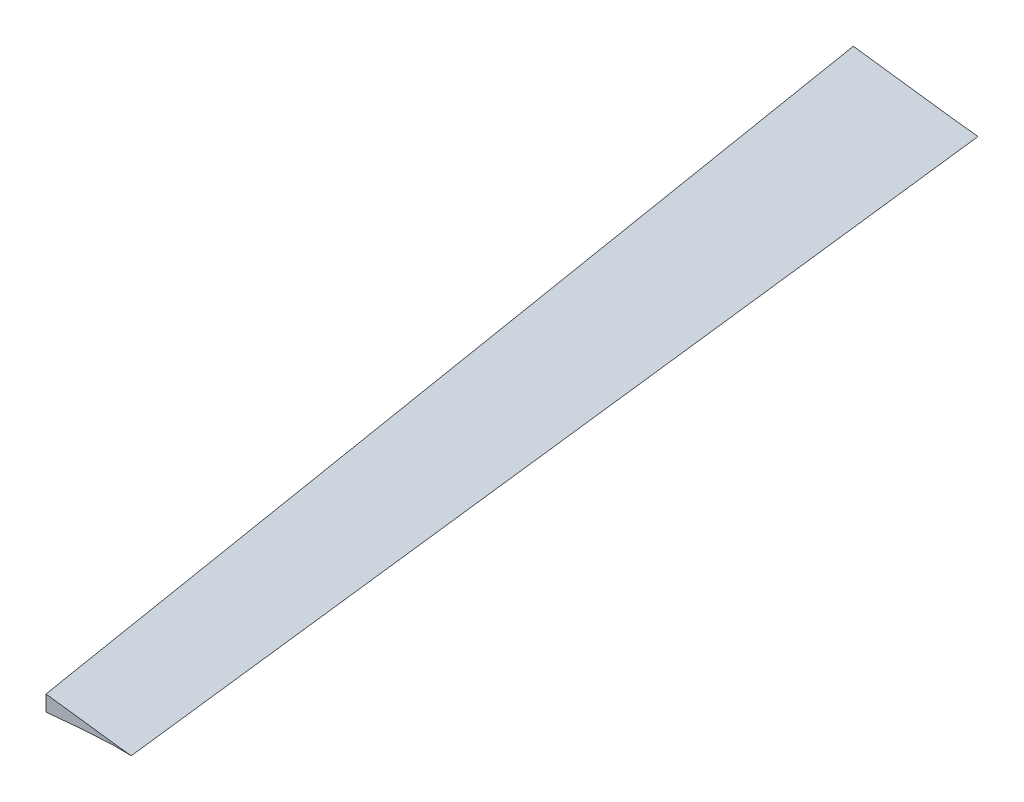
ISO-10303-21;
HEADER;
FILE_DESCRIPTION(('STEP AP214'),'2;1');
FILE_NAME('part.step','',(''),(''),'','','');
FILE_SCHEMA(('AUTOMOTIVE_DESIGN { 1 0 10303 214 1 1 1 1 }'));
ENDSEC;
DATA;
#1=APPLICATION_CONTEXT('core data for automotive mechanical design processes');
#2=APPLICATION_PROTOCOL_DEFINITION('international standard','automotive_design',2000,#1);
#3=PRODUCT_CONTEXT('',#1,'mechanical');
#4=PRODUCT('Part','Part','',(#3));
#5=PRODUCT_RELATED_PRODUCT_CATEGORY('part','',(#4));
#6=PRODUCT_DEFINITION_FORMATION('','',#4);
#7=PRODUCT_DEFINITION_CONTEXT('part definition',#1,'design');
#8=PRODUCT_DEFINITION('design','',#6,#7);
#9=PRODUCT_DEFINITION_SHAPE('','',#8);
#10=(LENGTH_UNIT() NAMED_UNIT(*) SI_UNIT(.MILLI.,.METRE.));
#11=(NAMED_UNIT(*) PLANE_ANGLE_UNIT() SI_UNIT($,.RADIAN.));
#12=(NAMED_UNIT(*) SI_UNIT($,.STERADIAN.) SOLID_ANGLE_UNIT());
#13=UNCERTAINTY_MEASURE_WITH_UNIT(LENGTH_MEASURE(1.E-05),#10,'distance_accuracy_value','');
#14=(GEOMETRIC_REPRESENTATION_CONTEXT(3) GLOBAL_UNCERTAINTY_ASSIGNED_CONTEXT((#13)) GLOBAL_UNIT_ASSIGNED_CONTEXT((#10,
#11,#12)) REPRESENTATION_CONTEXT('',''));
#15=CARTESIAN_POINT('',(0.,0.,0.));
#16=DIRECTION('',(0.,0.,1.));
#17=DIRECTION('',(1.,0.,0.));
#18=AXIS2_PLACEMENT_3D('',#15,#16,#17);
#19=CARTESIAN_POINT('',(564.25634571638,4.34483782472616,893.75));
#20=DIRECTION('',(1.03290946278982E-11,8.02308554522696E-11,1.));
#21=DIRECTION('',(0.,-1.,8.02308554522696E-11));
#22=AXIS2_PLACEMENT_3D('',#19,#20,#21);
#23=PLANE('',#22);
#24=DIRECTION('',(0.,1.,0.));
#25=VECTOR('',#24,1.);
#26=CARTESIAN_POINT('',(541.388775142328,-3.04859974673636,893.75));
#27=LINE('',#26,#25);
#28=CARTESIAN_POINT('',(541.388775142328,-3.04859974673636,893.75));
#29=VERTEX_POINT('',#28);
#30=CARTESIAN_POINT('',(541.388775142328,7.37022015255695,893.75));
#31=VERTEX_POINT('',#30);
#32=EDGE_CURVE('E242',#29,#31,#27,.T.);
#33=ORIENTED_EDGE('',*,*,#32,.F.);
#34=CARTESIAN_POINT('',(598.038775142328,0.16009125666234,893.75));
#35=CARTESIAN_POINT('',(595.580721104042,0.22766328568093,893.75));
#36=CARTESIAN_POINT('',(591.882966654915,0.329808752939016,893.75));
#37=CARTESIAN_POINT('',(586.933391400303,0.32409710421063,893.75));
#38=CARTESIAN_POINT('',(581.975538214962,0.177917623050471,893.75));
#39=CARTESIAN_POINT('',(577.01040024132,-0.115737844211306,893.75));
#40=CARTESIAN_POINT('',(570.793974388068,-0.520094719672208,893.75));
#41=CARTESIAN_POINT('',(565.814973863225,-0.881691189427431,893.75));
#42=CARTESIAN_POINT('',(559.589786901739,-1.38900859602894,893.75));
#43=CARTESIAN_POINT('',(551.85758353485,-2.06980213246714,893.75));
#44=CARTESIAN_POINT('',(545.376025557243,-2.67420703122534,893.75));
#45=CARTESIAN_POINT('',(541.388775142328,-3.04859974673636,893.75));
#46=B_SPLINE_CURVE_WITH_KNOTS('',3,(#34,#35,#36,#37,#38,#39,#40,#41,#42,#43,#44,#45),
.UNSPECIFIED.,.F.,.F.,(4,1,1,1,1,1,1,1,1,4),(0.,0.131488147376267,0.197232221064401,
0.262976294752535,0.394464442128803,0.460208515816937,0.591696663193205,0.657440736881338,
0.788928884257605,1.),.UNSPECIFIED.);
#47=CARTESIAN_POINT('',(598.038775142327,0.160091256662327,893.75));
#48=VERTEX_POINT('',#47);
#49=EDGE_CURVE('E13',#48,#29,#46,.T.);
#50=ORIENTED_EDGE('',*,*,#49,.F.);
#51=DIRECTION('',(0.993668003149023,-0.112356128083134,0.));
#52=VECTOR('',#51,1.);
#53=CARTESIAN_POINT('',(587.13407141594,1.39310900978286,893.75));
#54=LINE('',#53,#52);
#55=CARTESIAN_POINT('',(587.134977869464,1.40058375874533,893.75));
#56=VERTEX_POINT('',#55);
#57=EDGE_CURVE('E113',#56,#48,#54,.T.);
#58=ORIENTED_EDGE('',*,*,#57,.F.);
#59=CARTESIAN_POINT('',(541.388775142328,7.37022015255695,893.75));
#60=CARTESIAN_POINT('',(542.314635760137,7.25240663084081,893.75));
#61=CARTESIAN_POINT('',(545.287133728303,6.8711045704364,893.75));
#62=CARTESIAN_POINT('',(550.304364725651,6.21185169468793,893.75));
#63=CARTESIAN_POINT('',(556.440470239646,5.3929210014744,893.75));
#64=CARTESIAN_POINT('',(562.576183166571,4.57089402075966,893.75));
#65=CARTESIAN_POINT('',(568.711538568661,3.74598781379407,893.75));
#66=CARTESIAN_POINT('',(574.848161132087,2.92984097569769,893.75));
#67=CARTESIAN_POINT('',(580.98963720895,2.15018892866859,893.75));
#68=CARTESIAN_POINT('',(585.085921446884,1.64557517643275,893.75));
#69=CARTESIAN_POINT('',(587.134071415939,1.39310900978305,893.75));
#70=B_SPLINE_CURVE_WITH_KNOTS('',3,(#59,#60,#61,#62,#63,#64,#65,#66,#67,#68,#69),.UNSPECIFIED.,
.F.,.F.,(4,1,1,1,1,1,1,1,4),(0.,0.0606920988500119,0.194878941871439,0.329065784892866,
0.463252627914293,0.597439470935719,0.731626313957146,0.865813156978573,1.),.UNSPECIFIED.);
#71=EDGE_CURVE('E232',#31,#56,#70,.T.);
#72=ORIENTED_EDGE('',*,*,#71,.F.);
#73=EDGE_LOOP('',(#33,#50,#58,#72));
#74=FACE_BOUND('',#73,.T.);
#75=ADVANCED_FACE('F103',(#74),#23,.T.);
#76=CARTESIAN_POINT('',(473.363945444564,6.29781154114881,256.25));
#77=DIRECTION('',(-2.84895570752132E-11,-2.31413828593419E-10,-1.));
#78=DIRECTION('',(0.,1.,-2.31413828593419E-10));
#79=AXIS2_PLACEMENT_3D('',#76,#77,#78);
#80=PLANE('',#79);
#81=DIRECTION('',(0.,1.,0.));
#82=VECTOR('',#81,1.);
#83=CARTESIAN_POINT('',(440.228775142327,-4.41816618168187,256.25));
#84=LINE('',#83,#82);
#85=CARTESIAN_POINT('',(440.228775142327,-4.41816618168187,256.25));
#86=VERTEX_POINT('',#85);
#87=CARTESIAN_POINT('',(440.228775142327,10.6976152353225,256.25));
#88=VERTEX_POINT('',#87);
#89=EDGE_CURVE('E153',#86,#88,#84,.T.);
#90=ORIENTED_EDGE('',*,*,#89,.T.);
#91=CARTESIAN_POINT('',(506.516959670549,2.02824763226282,256.25));
#92=CARTESIAN_POINT('',(503.413789085055,2.41076141006962,256.25));
#93=CARTESIAN_POINT('',(497.207471701545,3.17530628062578,256.25));
#94=CARTESIAN_POINT('',(487.90246562231,4.35656416496528,256.25));
#95=CARTESIAN_POINT('',(478.604813145285,5.59311563809215,256.25));
#96=CARTESIAN_POINT('',(469.309080555886,6.84293851040028,256.25));
#97=CARTESIAN_POINT('',(460.012806277369,8.08839904091429,256.25));
#98=CARTESIAN_POINT('',(450.715937186623,9.32916835816602,256.249999999999));
#99=CARTESIAN_POINT('',(444.120816838155,10.1957523480049,256.25));
#100=CARTESIAN_POINT('',(440.624411845024,10.6466985559314,256.25));
#101=CARTESIAN_POINT('',(440.228775142327,10.6976152353225,256.25));
#102=B_SPLINE_CURVE_WITH_KNOTS('',3,(#91,#92,#93,#94,#95,#96,#97,#98,#99,#100,#101),
.UNSPECIFIED.,.F.,.F.,(4,1,1,1,1,1,1,1,4),(0.,0.140299917086805,0.28059983417361,
0.420899751260414,0.561199668347219,0.701499585434024,0.841799502520829,0.982099419607634,1.),.UNSPECIFIED.);
#103=CARTESIAN_POINT('',(506.518284716429,2.03917406721844,256.25));
#104=VERTEX_POINT('',#103);
#105=EDGE_CURVE('E168',#104,#88,#102,.T.);
#106=ORIENTED_EDGE('',*,*,#105,.F.);
#107=DIRECTION('',(-0.993668003149023,0.112356128083134,0.));
#108=VECTOR('',#107,1.);
#109=CARTESIAN_POINT('',(523.038775142327,0.160091256662327,256.25));
#110=LINE('',#109,#108);
#111=CARTESIAN_POINT('',(523.038775142327,0.160091256662324,256.25));
#112=VERTEX_POINT('',#111);
#113=EDGE_CURVE('E155',#112,#104,#110,.T.);
#114=ORIENTED_EDGE('',*,*,#113,.F.);
#115=CARTESIAN_POINT('',(440.228775142327,-4.41816618168187,256.25));
#116=CARTESIAN_POINT('',(445.265730808962,-3.9466557649069,256.25));
#117=CARTESIAN_POINT('',(454.078445522735,-3.1295827971776,256.25));
#118=CARTESIAN_POINT('',(464.784364502044,-2.18696397342086,256.25));
#119=CARTESIAN_POINT('',(474.216201701445,-1.41832277162378,256.25));
#120=CARTESIAN_POINT('',(481.759930533462,-0.870464682266808,256.250000000001));
#121=CARTESIAN_POINT('',(491.178493698355,-0.257819914583299,256.249999999999));
#122=CARTESIAN_POINT('',(498.701219253377,0.187100145980822,256.25));
#123=CARTESIAN_POINT('',(506.212907559604,0.408578003067788,256.25));
#124=CARTESIAN_POINT('',(513.712053897941,0.41723177383477,256.25));
#125=CARTESIAN_POINT('',(519.314555185581,0.262470250398515,256.25));
#126=CARTESIAN_POINT('',(523.038775142327,0.160091256662324,256.25));
#127=B_SPLINE_CURVE_WITH_KNOTS('',3,(#115,#116,#117,#118,#119,#120,#121,#122,#123,#124,#125,
#126),.UNSPECIFIED.,.F.,.F.,(4,1,1,1,1,1,1,1,1,4),(0.,0.182309909716823,0.318591591430685,
0.386732432287616,0.523014114001479,0.591154954858411,0.727436636572274,0.795577477429206,
0.863718318286137,1.),.UNSPECIFIED.);
#128=EDGE_CURVE('E149',#86,#112,#127,.T.);
#129=ORIENTED_EDGE('',*,*,#128,.F.);
#130=EDGE_LOOP('',(#90,#106,#114,#129));
#131=FACE_BOUND('',#130,.T.);
#132=ADVANCED_FACE('F151',(#131),#80,.T.);
#133=CARTESIAN_POINT('',(523.038775142327,0.16009125666234,256.25));
#134=CARTESIAN_POINT('',(548.038775142327,0.160091256662336,468.75));
#135=CARTESIAN_POINT('',(573.038775142327,0.160091256662331,681.25));
#136=CARTESIAN_POINT('',(598.038775142327,0.160091256662327,893.75));
#137=CARTESIAN_POINT('',(521.682237323651,0.313477836910268,256.25));
#138=CARTESIAN_POINT('',(546.826880568226,0.297122721456942,468.75));
#139=CARTESIAN_POINT('',(571.9715238128,0.280767606003617,681.25));
#140=CARTESIAN_POINT('',(597.116167057375,0.264412490550292,893.75));
#141=CARTESIAN_POINT('',(518.937430362964,0.623838924779777,256.25));
#142=CARTESIAN_POINT('',(544.389478873448,0.572724850277281,468.750000000001));
#143=CARTESIAN_POINT('',(569.841527383931,0.521610775774785,681.250000000001));
#144=CARTESIAN_POINT('',(595.293575894415,0.470496701272289,893.750000000001));
#145=CARTESIAN_POINT('',(514.771165549323,1.0949272375222,256.25));
#146=CARTESIAN_POINT('',(540.710982122887,0.988660203684612,468.75));
#147=CARTESIAN_POINT('',(566.65079869645,0.88239316984702,681.249999999999));
#148=CARTESIAN_POINT('',(592.590615270014,0.776126136009429,893.749999999999));
#149=CARTESIAN_POINT('',(510.608144558412,1.56564876441581,256.25));
#150=CARTESIAN_POINT('',(537.034031881982,1.40442068999717,468.750000000001));
#151=CARTESIAN_POINT('',(563.459919205552,1.24319261557854,681.250000000001));
#152=CARTESIAN_POINT('',(589.885806529122,1.0819645411599,893.750000000001));
#153=CARTESIAN_POINT('',(507.869554765347,1.87530686408459,256.25));
#154=CARTESIAN_POINT('',(534.599496008155,1.67969877442354,468.75));
#155=CARTESIAN_POINT('',(561.329437250964,1.48409068476248,681.25));
#156=CARTESIAN_POINT('',(588.059378493773,1.28848259510143,893.75));
#157=CARTESIAN_POINT('',(500.963521173061,2.71279483357428,256.25));
#158=CARTESIAN_POINT('',(528.420673244419,2.42899859480402,468.75));
#159=CARTESIAN_POINT('',(555.877825315776,2.14520235603377,681.25));
#160=CARTESIAN_POINT('',(583.334977387133,1.86140611726351,893.75));
#161=CARTESIAN_POINT('',(489.88764221468,4.07857273005197,256.25));
#162=CARTESIAN_POINT('',(518.497086213806,3.653165953022,468.75));
#163=CARTESIAN_POINT('',(547.106530212931,3.22775917599203,681.25));
#164=CARTESIAN_POINT('',(575.715974212057,2.80235239896206,893.75));
#165=CARTESIAN_POINT('',(473.346913385583,6.30070857969054,256.25));
#166=CARTESIAN_POINT('',(503.654291164973,5.64855337793149,468.75));
#167=CARTESIAN_POINT('',(533.961668944362,4.99639817617243,681.25));
#168=CARTESIAN_POINT('',(564.269046723752,4.34424297441338,893.75));
#169=CARTESIAN_POINT('',(456.814082858754,8.51892467026692,256.249999999999));
#170=CARTESIAN_POINT('',(488.814600752647,7.6392648712077,468.75));
#171=CARTESIAN_POINT('',(520.815118646541,6.75960507214848,681.25));
#172=CARTESIAN_POINT('',(552.815636540434,5.87994527308926,893.75));
#173=CARTESIAN_POINT('',(445.767553432239,9.9847991682499,256.25));
#174=CARTESIAN_POINT('',(478.909529582046,8.95189292309349,468.75));
#175=CARTESIAN_POINT('',(512.051505731853,7.91898667793708,681.25));
#176=CARTESIAN_POINT('',(545.193481881661,6.88608043278067,893.75));
#177=CARTESIAN_POINT('',(440.228775142327,10.6976152353225,256.25));
#178=CARTESIAN_POINT('',(473.948775142328,9.58848354106733,468.75));
#179=CARTESIAN_POINT('',(507.668775142328,8.47935184681214,681.25));
#180=CARTESIAN_POINT('',(541.388775142328,7.37022015255695,893.75));
#181=B_SPLINE_SURFACE_WITH_KNOTS('',3,3,((#133,#134,#135,#136),(#137,#138,#139,#140),(#141,#142,
#143,#144),(#145,#146,#147,#148),(#149,#150,#151,#152),(#153,#154,#155,#156),(#157,#158,#159,
#160),(#161,#162,#163,#164),(#165,#166,#167,#168),(#169,#170,#171,#172),(#173,#174,#175,#176),
(#177,#178,#179,#180)),.UNSPECIFIED.,.F.,.F.,.F.,(4,1,1,1,2,1,1,1,4),(4,4),(0.498565407541216,
0.523094332260958,0.547623256980701,0.572152181700444,0.596681106420187,0.69751082981514,
0.798340553210093,0.899170276605047,1.),(0.,1.),.UNSPECIFIED.);
#182=DIRECTION('',(0.156719407070029,-0.00515487726827554,0.987629715373109));
#183=VECTOR('',#182,1.);
#184=CARTESIAN_POINT('',(490.808775142328,9.03391769393974,575.));
#185=LINE('',#184,#183);
#186=EDGE_CURVE('E167',#88,#31,#185,.T.);
#187=DIRECTION('',(0.116841247567397,0.,0.993150604322876));
#188=VECTOR('',#187,1.);
#189=CARTESIAN_POINT('',(560.538775142327,0.160091256662334,575.));
#190=LINE('',#189,#188);
#191=EDGE_CURVE('E174',#112,#48,#190,.T.);
#192=ORIENTED_EDGE('',*,*,#113,.T.);
#193=ORIENTED_EDGE('',*,*,#105,.T.);
#194=ORIENTED_EDGE('',*,*,#186,.T.);
#195=ORIENTED_EDGE('',*,*,#71,.T.);
#196=ORIENTED_EDGE('',*,*,#57,.T.);
#197=ORIENTED_EDGE('',*,*,#191,.F.);
#198=EDGE_LOOP('',(#192,#193,#194,#195,#196,#197));
#199=FACE_BOUND('',#198,.T.);
#200=ADVANCED_FACE('F193',(#199),#181,.T.);
#201=CARTESIAN_POINT('',(440.228775142327,-4.41816618168187,256.25));
#202=CARTESIAN_POINT('',(473.948775142328,-3.96164403670004,468.75));
#203=CARTESIAN_POINT('',(507.668775142328,-3.5051218917182,681.25));
#204=CARTESIAN_POINT('',(541.388775142328,-3.04859974673636,893.75));
#205=CARTESIAN_POINT('',(443.682341979738,-4.09487710656566,256.25));
#206=CARTESIAN_POINT('',(477.038259471357,-3.67221068564129,468.75));
#207=CARTESIAN_POINT('',(510.394176962976,-3.24954426471692,681.25));
#208=CARTESIAN_POINT('',(543.750094454596,-2.82687784379255,893.75));
#209=CARTESIAN_POINT('',(450.595115017376,-3.4522756469538,256.25));
#210=CARTESIAN_POINT('',(483.222484116893,-3.09648588301535,468.75));
#211=CARTESIAN_POINT('',(515.849853216411,-2.7406961190769,681.25));
#212=CARTESIAN_POINT('',(548.477222315928,-2.38490635513845,893.75));
#213=CARTESIAN_POINT('',(460.973962189149,-2.51604895602818,256.249999999999));
#214=CARTESIAN_POINT('',(492.508024190077,-2.25700708899576,468.75));
#215=CARTESIAN_POINT('',(524.042086191006,-1.99796522196334,681.25));
#216=CARTESIAN_POINT('',(555.576148191935,-1.73892335493092,893.75));
#217=CARTESIAN_POINT('',(471.355624699941,-1.63655633315699,256.25));
#218=CARTESIAN_POINT('',(501.796380988907,-1.46641722850371,468.75));
#219=CARTESIAN_POINT('',(532.237137277872,-1.29627812385043,681.25));
#220=CARTESIAN_POINT('',(562.677893566838,-1.12613901919715,893.75));
#221=CARTESIAN_POINT('',(480.005584952657,-0.994235220161351,256.25));
#222=CARTESIAN_POINT('',(509.535632570281,-0.887956408699418,468.75));
#223=CARTESIAN_POINT('',(539.065680187905,-0.781677597237484,681.25));
#224=CARTESIAN_POINT('',(568.595727805529,-0.67539878577555,893.75));
#225=CARTESIAN_POINT('',(486.918798949692,-0.53317888168821,256.25));
#226=CARTESIAN_POINT('',(515.721165427807,-0.47355235786073,468.75));
#227=CARTESIAN_POINT('',(544.523531905922,-0.413925834033249,681.25));
#228=CARTESIAN_POINT('',(573.325898384037,-0.354299310205769,893.75));
#229=CARTESIAN_POINT('',(492.09929904093,-0.20497035684545,256.249999999999));
#230=CARTESIAN_POINT('',(520.356395511514,-0.178966118095808,468.749999999999));
#231=CARTESIAN_POINT('',(548.613491982098,-0.152961879346166,681.25));
#232=CARTESIAN_POINT('',(576.870588452682,-0.126957640596524,893.75));
#233=CARTESIAN_POINT('',(497.274492215249,0.087858341006276,256.25));
#234=CARTESIAN_POINT('',(524.986836995235,0.0854766166233383,468.75));
#235=CARTESIAN_POINT('',(552.699181775221,0.0830948922404006,681.25));
#236=CARTESIAN_POINT('',(580.411526555207,0.0807131678574628,893.75));
#237=CARTESIAN_POINT('',(502.445197899654,0.309450412558754,256.25));
#238=CARTESIAN_POINT('',(529.613195807783,0.286934322116312,468.75));
#239=CARTESIAN_POINT('',(556.781193715911,0.26441823167387,681.25));
#240=CARTESIAN_POINT('',(583.949191624039,0.241902141231428,893.75));
#241=CARTESIAN_POINT('',(507.610518411841,0.420567158436773,256.25));
#242=CARTESIAN_POINT('',(534.234776019313,0.390250513959586,468.750000000001));
#243=CARTESIAN_POINT('',(560.859033626785,0.3599338694824,681.250000000001));
#244=CARTESIAN_POINT('',(587.483291234257,0.329617225005214,893.750000000001));
#245=CARTESIAN_POINT('',(512.76672596095,0.401058667237522,256.25));
#246=CARTESIAN_POINT('',(538.848240677415,0.375037934728129,468.75));
#247=CARTESIAN_POINT('',(564.929755393881,0.349017202218737,681.25));
#248=CARTESIAN_POINT('',(591.011270110346,0.322996469709345,893.75));
#249=CARTESIAN_POINT('',(517.910342438343,0.301573199560006,256.25));
#250=CARTESIAN_POINT('',(543.450363987222,0.286654461839388,468.75));
#251=CARTESIAN_POINT('',(568.9903855361,0.271735724118771,681.25));
#252=CARTESIAN_POINT('',(594.530407084979,0.256816986398154,893.75));
#253=CARTESIAN_POINT('',(521.330814509839,0.20704318026675,256.25));
#254=CARTESIAN_POINT('',(546.510674072292,0.202098831857782,468.75));
#255=CARTESIAN_POINT('',(571.690533634746,0.197154483448814,681.25));
#256=CARTESIAN_POINT('',(596.870393197199,0.192210135039845,893.75));
#257=CARTESIAN_POINT('',(523.038775142327,0.16009125666234,256.25));
#258=CARTESIAN_POINT('',(548.038775142327,0.160091256662336,468.75));
#259=CARTESIAN_POINT('',(573.038775142327,0.160091256662331,681.25));
#260=CARTESIAN_POINT('',(598.038775142327,0.160091256662327,893.75));
#261=B_SPLINE_SURFACE_WITH_KNOTS('',3,3,((#201,#202,#203,#204),(#205,#206,#207,#208),(#209,#210,
#211,#212),(#213,#214,#215,#216),(#217,#218,#219,#220),(#221,#222,#223,#224),(#225,#226,#227,
#228),(#229,#230,#231,#232),(#233,#234,#235,#236),(#237,#238,#239,#240),(#241,#242,#243,#244),
(#245,#246,#247,#248),(#249,#250,#251,#252),(#253,#254,#255,#256),(#257,#258,#259,#260)),
.UNSPECIFIED.,.F.,.F.,.F.,(4,1,1,1,1,1,1,1,1,1,1,1,4),(4,4),(0.,0.0623206759426519,
0.124641351885304,0.186962027827956,0.249282703770608,0.280443041741934,0.31160337971326,
0.342763717684586,0.373924055655912,0.405084393627238,0.436244731598564,0.46740506956989,
0.498565407541216),(0.,1.),.UNSPECIFIED.);
#262=DIRECTION('',(0.156721136566072,0.00212178734961846,0.987640614480734));
#263=VECTOR('',#262,1.);
#264=CARTESIAN_POINT('',(490.808775142328,-3.73338296420912,575.));
#265=LINE('',#264,#263);
#266=EDGE_CURVE('E121',#86,#29,#265,.T.);
#267=ORIENTED_EDGE('',*,*,#128,.T.);
#268=ORIENTED_EDGE('',*,*,#191,.T.);
#269=ORIENTED_EDGE('',*,*,#49,.T.);
#270=ORIENTED_EDGE('',*,*,#266,.F.);
#271=EDGE_LOOP('',(#267,#268,#269,#270));
#272=FACE_BOUND('',#271,.T.);
#273=ADVANCED_FACE('F172',(#272),#261,.T.);
#274=CARTESIAN_POINT('',(440.228775142328,10.6976152353225,256.25));
#275=DIRECTION('',(-0.987642837658156,0.,0.156721489345097));
#276=DIRECTION('',(0.,-1.,0.));
#277=AXIS2_PLACEMENT_3D('',#274,#275,#276);
#278=PLANE('',#277);
#279=ORIENTED_EDGE('',*,*,#89,.F.);
#280=ORIENTED_EDGE('',*,*,#266,.T.);
#281=ORIENTED_EDGE('',*,*,#32,.T.);
#282=ORIENTED_EDGE('',*,*,#186,.F.);
#283=EDGE_LOOP('',(#279,#280,#281,#282));
#284=FACE_BOUND('',#283,.T.);
#285=ADVANCED_FACE('F165',(#284),#278,.T.);
#286=CLOSED_SHELL('',(#75,#132,#200,#273,#285));
#287=MANIFOLD_SOLID_BREP('B2',#286);
#288=ADVANCED_BREP_SHAPE_REPRESENTATION('',(#18,#287),#14);
#289=SHAPE_DEFINITION_REPRESENTATION(#9,#288);
ENDSEC;
END-ISO-10303-21;
